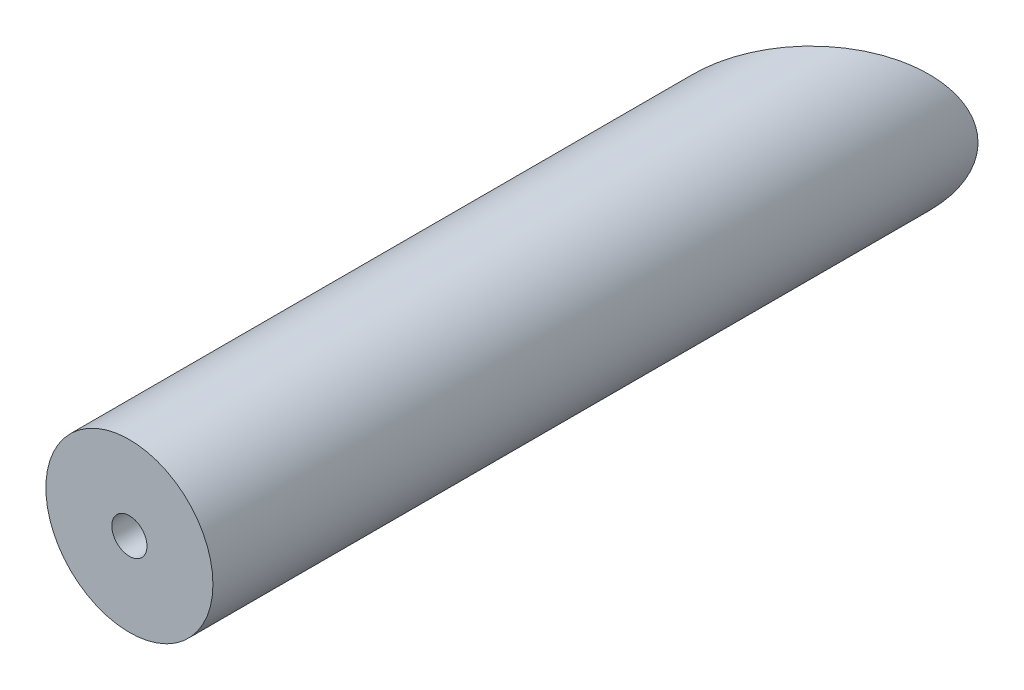
ISO-10303-21;
HEADER;
FILE_DESCRIPTION(('STEP AP214'),'2;1');
FILE_NAME('part.step','',(''),(''),'','','');
FILE_SCHEMA(('AUTOMOTIVE_DESIGN { 1 0 10303 214 1 1 1 1 }'));
ENDSEC;
DATA;
#1=APPLICATION_CONTEXT('core data for automotive mechanical design processes');
#2=APPLICATION_PROTOCOL_DEFINITION('international standard','automotive_design',2000,#1);
#3=PRODUCT_CONTEXT('',#1,'mechanical');
#4=PRODUCT('Part','Part','',(#3));
#5=PRODUCT_RELATED_PRODUCT_CATEGORY('part','',(#4));
#6=PRODUCT_DEFINITION_FORMATION('','',#4);
#7=PRODUCT_DEFINITION_CONTEXT('part definition',#1,'design');
#8=PRODUCT_DEFINITION('design','',#6,#7);
#9=PRODUCT_DEFINITION_SHAPE('','',#8);
#10=(LENGTH_UNIT() NAMED_UNIT(*) SI_UNIT(.MILLI.,.METRE.));
#11=(NAMED_UNIT(*) PLANE_ANGLE_UNIT() SI_UNIT($,.RADIAN.));
#12=(NAMED_UNIT(*) SI_UNIT($,.STERADIAN.) SOLID_ANGLE_UNIT());
#13=UNCERTAINTY_MEASURE_WITH_UNIT(LENGTH_MEASURE(1.E-05),#10,'distance_accuracy_value','');
#14=(GEOMETRIC_REPRESENTATION_CONTEXT(3) GLOBAL_UNCERTAINTY_ASSIGNED_CONTEXT((#13)) GLOBAL_UNIT_ASSIGNED_CONTEXT((#10,
#11,#12)) REPRESENTATION_CONTEXT('',''));
#15=CARTESIAN_POINT('',(0.,0.,0.));
#16=DIRECTION('',(0.,0.,1.));
#17=DIRECTION('',(1.,0.,0.));
#18=AXIS2_PLACEMENT_3D('',#15,#16,#17);
#19=CARTESIAN_POINT('',(0.,0.,276.225));
#20=DIRECTION('',(0.,0.,1.));
#21=DIRECTION('',(1.,0.,0.));
#22=AXIS2_PLACEMENT_3D('',#19,#20,#21);
#23=PLANE('',#22);
#24=CARTESIAN_POINT('',(0.,0.,276.225));
#25=DIRECTION('',(0.,0.,1.));
#26=DIRECTION('',(1.,0.,0.));
#27=AXIS2_PLACEMENT_3D('',#24,#25,#26);
#28=CIRCLE('',#27,30.1625);
#29=CARTESIAN_POINT('',(30.1625,0.,276.225));
#30=VERTEX_POINT('',#29);
#31=EDGE_CURVE('E12',#30,#30,#28,.T.);
#32=ORIENTED_EDGE('',*,*,#31,.T.);
#33=EDGE_LOOP('',(#32));
#34=FACE_BOUND('',#33,.T.);
#35=CARTESIAN_POINT('',(0.,0.,276.225));
#36=DIRECTION('',(0.,0.,1.));
#37=DIRECTION('',(1.,0.,0.));
#38=AXIS2_PLACEMENT_3D('',#35,#36,#37);
#39=CIRCLE('',#38,6.35);
#40=CARTESIAN_POINT('',(6.35,0.,276.225));
#41=VERTEX_POINT('',#40);
#42=EDGE_CURVE('E51',#41,#41,#39,.T.);
#43=ORIENTED_EDGE('',*,*,#42,.F.);
#44=EDGE_LOOP('',(#43));
#45=FACE_BOUND('',#44,.T.);
#46=ADVANCED_FACE('F43',(#34,#45),#23,.T.);
#47=CARTESIAN_POINT('',(0.,0.,276.225));
#48=DIRECTION('',(0.,0.,-1.));
#49=DIRECTION('',(-1.,0.,0.));
#50=AXIS2_PLACEMENT_3D('',#47,#48,#49);
#51=CYLINDRICAL_SURFACE('',#50,30.1625);
#52=ORIENTED_EDGE('',*,*,#31,.F.);
#53=EDGE_LOOP('',(#52));
#54=FACE_BOUND('',#53,.T.);
#55=CARTESIAN_POINT('',(0.,0.,30.1625));
#56=DIRECTION('',(0.707106781186548,0.,0.707106781186548));
#57=DIRECTION('',(0.707106781186548,0.,-0.707106781186548));
#58=AXIS2_PLACEMENT_3D('',#55,#56,#57);
#59=ELLIPSE('',#58,42.6562165750785,30.1625);
#60=CARTESIAN_POINT('',(30.1625,0.,0.));
#61=VERTEX_POINT('',#60);
#62=EDGE_CURVE('E55',#61,#61,#59,.T.);
#63=ORIENTED_EDGE('',*,*,#62,.T.);
#64=EDGE_LOOP('',(#63));
#65=FACE_BOUND('',#64,.T.);
#66=ADVANCED_FACE('F45',(#54,#65),#51,.T.);
#67=CARTESIAN_POINT('',(0.,0.,276.225));
#68=DIRECTION('',(0.,0.,-1.));
#69=DIRECTION('',(-1.,0.,0.));
#70=AXIS2_PLACEMENT_3D('',#67,#68,#69);
#71=CYLINDRICAL_SURFACE('',#70,6.35);
#72=CARTESIAN_POINT('',(0.,0.,30.1625));
#73=DIRECTION('',(0.707106781186548,0.,0.707106781186548));
#74=DIRECTION('',(0.707106781186548,0.,-0.707106781186548));
#75=AXIS2_PLACEMENT_3D('',#72,#73,#74);
#76=ELLIPSE('',#75,8.98025612106915,6.35);
#77=CARTESIAN_POINT('',(6.35,0.,23.8125));
#78=VERTEX_POINT('',#77);
#79=EDGE_CURVE('E47',#78,#78,#76,.T.);
#80=ORIENTED_EDGE('',*,*,#79,.F.);
#81=EDGE_LOOP('',(#80));
#82=FACE_BOUND('',#81,.T.);
#83=ORIENTED_EDGE('',*,*,#42,.T.);
#84=EDGE_LOOP('',(#83));
#85=FACE_BOUND('',#84,.T.);
#86=ADVANCED_FACE('F67',(#82,#85),#71,.F.);
#87=CARTESIAN_POINT('',(30.1625,-30.1625,0.));
#88=DIRECTION('',(0.707106781186548,0.,0.707106781186548));
#89=DIRECTION('',(0.707106781186548,0.,-0.707106781186548));
#90=AXIS2_PLACEMENT_3D('',#87,#88,#89);
#91=PLANE('',#90);
#92=ORIENTED_EDGE('',*,*,#79,.T.);
#93=EDGE_LOOP('',(#92));
#94=FACE_BOUND('',#93,.T.);
#95=ORIENTED_EDGE('',*,*,#62,.F.);
#96=EDGE_LOOP('',(#95));
#97=FACE_BOUND('',#96,.T.);
#98=ADVANCED_FACE('F64',(#94,#97),#91,.F.);
#99=CLOSED_SHELL('',(#46,#66,#86,#98));
#100=MANIFOLD_SOLID_BREP('B2',#99);
#101=ADVANCED_BREP_SHAPE_REPRESENTATION('',(#18,#100),#14);
#102=SHAPE_DEFINITION_REPRESENTATION(#9,#101);
ENDSEC;
END-ISO-10303-21;
